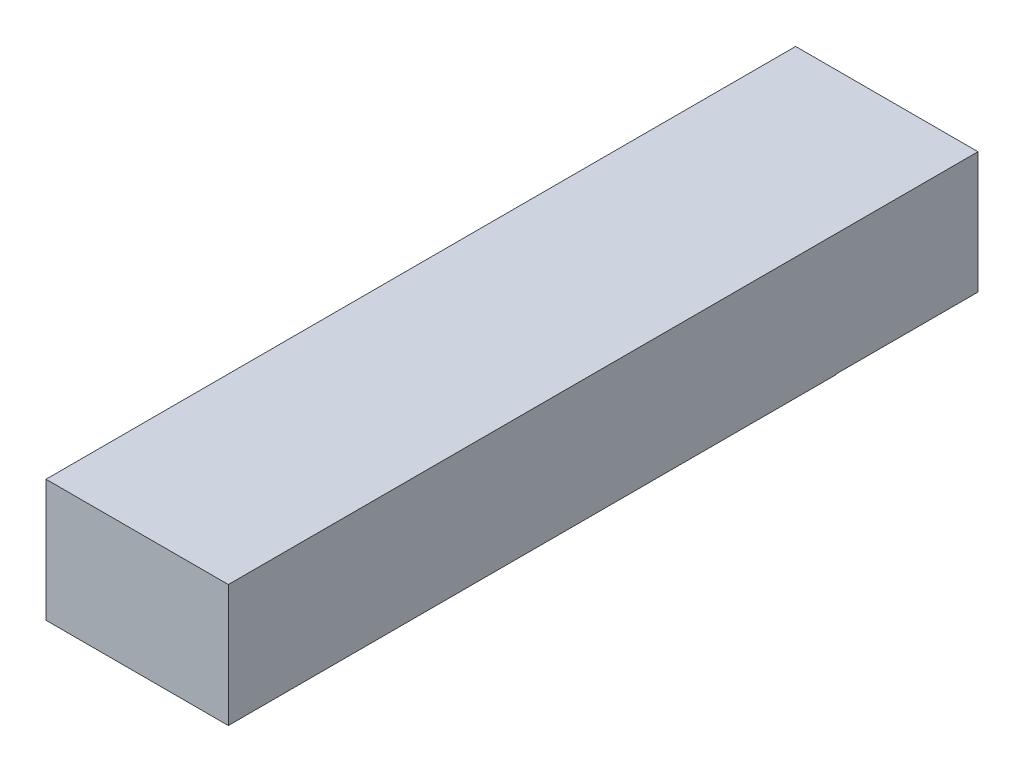
ISO-10303-21;
HEADER;
FILE_DESCRIPTION(('STEP AP214'),'2;1');
FILE_NAME('part.step','',(''),(''),'','','');
FILE_SCHEMA(('AUTOMOTIVE_DESIGN { 1 0 10303 214 1 1 1 1 }'));
ENDSEC;
DATA;
#1=APPLICATION_CONTEXT('core data for automotive mechanical design processes');
#2=APPLICATION_PROTOCOL_DEFINITION('international standard','automotive_design',2000,#1);
#3=PRODUCT_CONTEXT('',#1,'mechanical');
#4=PRODUCT('Part','Part','',(#3));
#5=PRODUCT_RELATED_PRODUCT_CATEGORY('part','',(#4));
#6=PRODUCT_DEFINITION_FORMATION('','',#4);
#7=PRODUCT_DEFINITION_CONTEXT('part definition',#1,'design');
#8=PRODUCT_DEFINITION('design','',#6,#7);
#9=PRODUCT_DEFINITION_SHAPE('','',#8);
#10=(LENGTH_UNIT() NAMED_UNIT(*) SI_UNIT(.MILLI.,.METRE.));
#11=(NAMED_UNIT(*) PLANE_ANGLE_UNIT() SI_UNIT($,.RADIAN.));
#12=(NAMED_UNIT(*) SI_UNIT($,.STERADIAN.) SOLID_ANGLE_UNIT());
#13=UNCERTAINTY_MEASURE_WITH_UNIT(LENGTH_MEASURE(1.E-05),#10,'distance_accuracy_value','');
#14=(GEOMETRIC_REPRESENTATION_CONTEXT(3) GLOBAL_UNCERTAINTY_ASSIGNED_CONTEXT((#13)) GLOBAL_UNIT_ASSIGNED_CONTEXT((#10,
#11,#12)) REPRESENTATION_CONTEXT('',''));
#15=CARTESIAN_POINT('',(0.,0.,0.));
#16=DIRECTION('',(0.,0.,1.));
#17=DIRECTION('',(1.,0.,0.));
#18=AXIS2_PLACEMENT_3D('',#15,#16,#17);
#19=CARTESIAN_POINT('',(2.8,-0.300000000000001,7.));
#20=DIRECTION('',(0.,-1.,0.));
#21=DIRECTION('',(0.,0.,-1.));
#22=AXIS2_PLACEMENT_3D('',#19,#20,#21);
#23=PLANE('',#22);
#24=DIRECTION('',(-1.,0.,0.));
#25=VECTOR('',#24,1.);
#26=CARTESIAN_POINT('',(2.8,-0.300000000000001,0.));
#27=LINE('',#26,#25);
#28=CARTESIAN_POINT('',(2.8,-0.300000000000001,0.));
#29=VERTEX_POINT('',#28);
#30=CARTESIAN_POINT('',(1.2,-0.300000000000001,0.));
#31=VERTEX_POINT('',#30);
#32=EDGE_CURVE('E172',#29,#31,#27,.T.);
#33=ORIENTED_EDGE('',*,*,#32,.T.);
#34=DIRECTION('',(0.,0.,-1.));
#35=VECTOR('',#34,1.);
#36=CARTESIAN_POINT('',(1.2,-0.300000000000001,7.));
#37=LINE('',#36,#35);
#38=CARTESIAN_POINT('',(1.2,-0.300000000000001,7.));
#39=VERTEX_POINT('',#38);
#40=EDGE_CURVE('E11',#39,#31,#37,.T.);
#41=ORIENTED_EDGE('',*,*,#40,.F.);
#42=DIRECTION('',(-1.,0.,0.));
#43=VECTOR('',#42,1.);
#44=CARTESIAN_POINT('',(2.8,-0.300000000000001,7.));
#45=LINE('',#44,#43);
#46=CARTESIAN_POINT('',(2.8,-0.300000000000001,7.));
#47=VERTEX_POINT('',#46);
#48=EDGE_CURVE('E207',#47,#39,#45,.T.);
#49=ORIENTED_EDGE('',*,*,#48,.F.);
#50=DIRECTION('',(0.,0.,-1.));
#51=VECTOR('',#50,1.);
#52=CARTESIAN_POINT('',(2.8,-0.300000000000001,7.));
#53=LINE('',#52,#51);
#54=EDGE_CURVE('E171',#47,#29,#53,.T.);
#55=ORIENTED_EDGE('',*,*,#54,.T.);
#56=EDGE_LOOP('',(#33,#41,#49,#55));
#57=FACE_BOUND('',#56,.T.);
#58=ADVANCED_FACE('F39',(#57),#23,.F.);
#59=CARTESIAN_POINT('',(1.2,-0.300000000000001,7.));
#60=DIRECTION('',(1.,0.,0.));
#61=DIRECTION('',(0.,1.,0.));
#62=AXIS2_PLACEMENT_3D('',#59,#60,#61);
#63=PLANE('',#62);
#64=DIRECTION('',(0.,-1.,0.));
#65=VECTOR('',#64,1.);
#66=CARTESIAN_POINT('',(1.2,-0.300000000000001,0.));
#67=LINE('',#66,#65);
#68=CARTESIAN_POINT('',(1.2,-2.,0.));
#69=VERTEX_POINT('',#68);
#70=EDGE_CURVE('E176',#31,#69,#67,.T.);
#71=ORIENTED_EDGE('',*,*,#70,.T.);
#72=DIRECTION('',(0.,0.,-1.));
#73=VECTOR('',#72,1.);
#74=CARTESIAN_POINT('',(1.2,-2.,7.));
#75=LINE('',#74,#73);
#76=CARTESIAN_POINT('',(1.2,-2.,7.));
#77=VERTEX_POINT('',#76);
#78=EDGE_CURVE('E48',#77,#69,#75,.T.);
#79=ORIENTED_EDGE('',*,*,#78,.F.);
#80=DIRECTION('',(0.,-1.,0.));
#81=VECTOR('',#80,1.);
#82=CARTESIAN_POINT('',(1.2,-0.300000000000001,7.));
#83=LINE('',#82,#81);
#84=EDGE_CURVE('E110',#39,#77,#83,.T.);
#85=ORIENTED_EDGE('',*,*,#84,.F.);
#86=ORIENTED_EDGE('',*,*,#40,.T.);
#87=EDGE_LOOP('',(#71,#79,#85,#86));
#88=FACE_BOUND('',#87,.T.);
#89=ADVANCED_FACE('F315',(#88),#63,.F.);
#90=CARTESIAN_POINT('',(1.2,-2.,7.));
#91=DIRECTION('',(0.,1.,0.));
#92=DIRECTION('',(-1.,0.,0.));
#93=AXIS2_PLACEMENT_3D('',#90,#91,#92);
#94=PLANE('',#93);
#95=DIRECTION('',(1.,0.,0.));
#96=VECTOR('',#95,1.);
#97=CARTESIAN_POINT('',(1.2,-2.,0.));
#98=LINE('',#97,#96);
#99=CARTESIAN_POINT('',(4.5,-2.,0.));
#100=VERTEX_POINT('',#99);
#101=EDGE_CURVE('E180',#69,#100,#98,.T.);
#102=ORIENTED_EDGE('',*,*,#101,.T.);
#103=DIRECTION('',(0.,0.,-1.));
#104=VECTOR('',#103,1.);
#105=CARTESIAN_POINT('',(4.5,-2.,7.));
#106=LINE('',#105,#104);
#107=CARTESIAN_POINT('',(4.5,-2.,7.));
#108=VERTEX_POINT('',#107);
#109=EDGE_CURVE('E232',#108,#100,#106,.T.);
#110=ORIENTED_EDGE('',*,*,#109,.F.);
#111=DIRECTION('',(1.,0.,0.));
#112=VECTOR('',#111,1.);
#113=CARTESIAN_POINT('',(1.2,-2.,7.));
#114=LINE('',#113,#112);
#115=EDGE_CURVE('E242',#77,#108,#114,.T.);
#116=ORIENTED_EDGE('',*,*,#115,.F.);
#117=ORIENTED_EDGE('',*,*,#78,.T.);
#118=EDGE_LOOP('',(#102,#110,#116,#117));
#119=FACE_BOUND('',#118,.T.);
#120=ADVANCED_FACE('F240',(#119),#94,.F.);
#121=CARTESIAN_POINT('',(4.5,-2.,7.));
#122=DIRECTION('',(-1.,0.,0.));
#123=DIRECTION('',(0.,0.,1.));
#124=AXIS2_PLACEMENT_3D('',#121,#122,#123);
#125=PLANE('',#124);
#126=DIRECTION('',(0.,1.,0.));
#127=VECTOR('',#126,1.);
#128=CARTESIAN_POINT('',(4.5,-2.,0.));
#129=LINE('',#128,#127);
#130=CARTESIAN_POINT('',(4.5,4.,0.));
#131=VERTEX_POINT('',#130);
#132=EDGE_CURVE('E183',#100,#131,#129,.T.);
#133=ORIENTED_EDGE('',*,*,#132,.T.);
#134=DIRECTION('',(0.,0.,-1.));
#135=VECTOR('',#134,1.);
#136=CARTESIAN_POINT('',(4.5,4.,7.));
#137=LINE('',#136,#135);
#138=CARTESIAN_POINT('',(4.5,4.,37.));
#139=VERTEX_POINT('',#138);
#140=EDGE_CURVE('E228',#139,#131,#137,.T.);
#141=ORIENTED_EDGE('',*,*,#140,.F.);
#142=DIRECTION('',(0.,1.,0.));
#143=VECTOR('',#142,1.);
#144=CARTESIAN_POINT('',(4.5,4.,37.));
#145=LINE('',#144,#143);
#146=CARTESIAN_POINT('',(4.5,-2.02868254739902,37.));
#147=VERTEX_POINT('',#146);
#148=EDGE_CURVE('E270',#147,#139,#145,.T.);
#149=ORIENTED_EDGE('',*,*,#148,.F.);
#150=DIRECTION('',(0.,0.,-1.));
#151=VECTOR('',#150,1.);
#152=CARTESIAN_POINT('',(4.5,-2.02868254739902,37.));
#153=LINE('',#152,#151);
#154=CARTESIAN_POINT('',(4.5,-2.02868254739902,7.));
#155=VERTEX_POINT('',#154);
#156=EDGE_CURVE('E269',#147,#155,#153,.T.);
#157=ORIENTED_EDGE('',*,*,#156,.T.);
#158=DIRECTION('',(0.,1.,0.));
#159=VECTOR('',#158,1.);
#160=CARTESIAN_POINT('',(4.5,4.,7.));
#161=LINE('',#160,#159);
#162=EDGE_CURVE('E288',#155,#108,#161,.T.);
#163=ORIENTED_EDGE('',*,*,#162,.T.);
#164=ORIENTED_EDGE('',*,*,#109,.T.);
#165=EDGE_LOOP('',(#133,#141,#149,#157,#163,#164));
#166=FACE_BOUND('',#165,.T.);
#167=ADVANCED_FACE('F251',(#166),#125,.F.);
#168=CARTESIAN_POINT('',(-4.5,4.,7.));
#169=DIRECTION('',(0.,-1.,0.));
#170=DIRECTION('',(0.,0.,-1.));
#171=AXIS2_PLACEMENT_3D('',#168,#169,#170);
#172=PLANE('',#171);
#173=DIRECTION('',(-1.,0.,0.));
#174=VECTOR('',#173,1.);
#175=CARTESIAN_POINT('',(-4.5,4.,0.));
#176=LINE('',#175,#174);
#177=CARTESIAN_POINT('',(-4.5,4.,0.));
#178=VERTEX_POINT('',#177);
#179=EDGE_CURVE('E186',#131,#178,#176,.T.);
#180=ORIENTED_EDGE('',*,*,#179,.T.);
#181=DIRECTION('',(0.,0.,-1.));
#182=VECTOR('',#181,1.);
#183=CARTESIAN_POINT('',(-4.5,4.,7.));
#184=LINE('',#183,#182);
#185=CARTESIAN_POINT('',(-4.5,4.,37.));
#186=VERTEX_POINT('',#185);
#187=EDGE_CURVE('E224',#186,#178,#184,.T.);
#188=ORIENTED_EDGE('',*,*,#187,.F.);
#189=DIRECTION('',(-1.,0.,0.));
#190=VECTOR('',#189,1.);
#191=CARTESIAN_POINT('',(-4.5,4.,37.));
#192=LINE('',#191,#190);
#193=EDGE_CURVE('E261',#139,#186,#192,.T.);
#194=ORIENTED_EDGE('',*,*,#193,.F.);
#195=ORIENTED_EDGE('',*,*,#140,.T.);
#196=EDGE_LOOP('',(#180,#188,#194,#195));
#197=FACE_BOUND('',#196,.T.);
#198=ADVANCED_FACE('F258',(#197),#172,.F.);
#199=CARTESIAN_POINT('',(-4.5,-2.,7.));
#200=DIRECTION('',(1.,0.,0.));
#201=DIRECTION('',(0.,0.,-1.));
#202=AXIS2_PLACEMENT_3D('',#199,#200,#201);
#203=PLANE('',#202);
#204=DIRECTION('',(0.,-1.,0.));
#205=VECTOR('',#204,1.);
#206=CARTESIAN_POINT('',(-4.5,-2.,0.));
#207=LINE('',#206,#205);
#208=CARTESIAN_POINT('',(-4.5,-2.,0.));
#209=VERTEX_POINT('',#208);
#210=EDGE_CURVE('E189',#178,#209,#207,.T.);
#211=ORIENTED_EDGE('',*,*,#210,.T.);
#212=DIRECTION('',(0.,0.,-1.));
#213=VECTOR('',#212,1.);
#214=CARTESIAN_POINT('',(-4.5,-2.,7.));
#215=LINE('',#214,#213);
#216=CARTESIAN_POINT('',(-4.5,-2.,7.));
#217=VERTEX_POINT('',#216);
#218=EDGE_CURVE('E220',#217,#209,#215,.T.);
#219=ORIENTED_EDGE('',*,*,#218,.F.);
#220=DIRECTION('',(0.,-1.,0.));
#221=VECTOR('',#220,1.);
#222=CARTESIAN_POINT('',(-4.5,4.,7.));
#223=LINE('',#222,#221);
#224=CARTESIAN_POINT('',(-4.5,-2.02868254739902,7.));
#225=VERTEX_POINT('',#224);
#226=EDGE_CURVE('E280',#217,#225,#223,.T.);
#227=ORIENTED_EDGE('',*,*,#226,.T.);
#228=DIRECTION('',(0.,0.,-1.));
#229=VECTOR('',#228,1.);
#230=CARTESIAN_POINT('',(-4.5,-2.02868254739902,37.));
#231=LINE('',#230,#229);
#232=CARTESIAN_POINT('',(-4.5,-2.02868254739902,37.));
#233=VERTEX_POINT('',#232);
#234=EDGE_CURVE('E177',#233,#225,#231,.T.);
#235=ORIENTED_EDGE('',*,*,#234,.F.);
#236=DIRECTION('',(0.,-1.,0.));
#237=VECTOR('',#236,1.);
#238=CARTESIAN_POINT('',(-4.5,4.,37.));
#239=LINE('',#238,#237);
#240=EDGE_CURVE('E290',#186,#233,#239,.T.);
#241=ORIENTED_EDGE('',*,*,#240,.F.);
#242=ORIENTED_EDGE('',*,*,#187,.T.);
#243=EDGE_LOOP('',(#211,#219,#227,#235,#241,#242));
#244=FACE_BOUND('',#243,.T.);
#245=ADVANCED_FACE('F327',(#244),#203,.F.);
#246=CARTESIAN_POINT('',(-1.2,-2.,7.));
#247=DIRECTION('',(0.,1.,0.));
#248=DIRECTION('',(-1.,0.,0.));
#249=AXIS2_PLACEMENT_3D('',#246,#247,#248);
#250=PLANE('',#249);
#251=DIRECTION('',(1.,0.,0.));
#252=VECTOR('',#251,1.);
#253=CARTESIAN_POINT('',(-1.2,-2.,0.));
#254=LINE('',#253,#252);
#255=CARTESIAN_POINT('',(-1.2,-2.,0.));
#256=VERTEX_POINT('',#255);
#257=EDGE_CURVE('E192',#209,#256,#254,.T.);
#258=ORIENTED_EDGE('',*,*,#257,.T.);
#259=DIRECTION('',(0.,0.,-1.));
#260=VECTOR('',#259,1.);
#261=CARTESIAN_POINT('',(-1.2,-2.,7.));
#262=LINE('',#261,#260);
#263=CARTESIAN_POINT('',(-1.2,-2.,7.));
#264=VERTEX_POINT('',#263);
#265=EDGE_CURVE('E216',#264,#256,#262,.T.);
#266=ORIENTED_EDGE('',*,*,#265,.F.);
#267=DIRECTION('',(1.,0.,0.));
#268=VECTOR('',#267,1.);
#269=CARTESIAN_POINT('',(-1.2,-2.,7.));
#270=LINE('',#269,#268);
#271=EDGE_CURVE('E161',#217,#264,#270,.T.);
#272=ORIENTED_EDGE('',*,*,#271,.F.);
#273=ORIENTED_EDGE('',*,*,#218,.T.);
#274=EDGE_LOOP('',(#258,#266,#272,#273));
#275=FACE_BOUND('',#274,.T.);
#276=ADVANCED_FACE('F306',(#275),#250,.F.);
#277=CARTESIAN_POINT('',(-1.2,-0.300000000000001,7.));
#278=DIRECTION('',(-1.,0.,0.));
#279=DIRECTION('',(0.,-1.,0.));
#280=AXIS2_PLACEMENT_3D('',#277,#278,#279);
#281=PLANE('',#280);
#282=DIRECTION('',(0.,1.,0.));
#283=VECTOR('',#282,1.);
#284=CARTESIAN_POINT('',(-1.2,-0.300000000000001,0.));
#285=LINE('',#284,#283);
#286=CARTESIAN_POINT('',(-1.2,-0.300000000000001,0.));
#287=VERTEX_POINT('',#286);
#288=EDGE_CURVE('E195',#256,#287,#285,.T.);
#289=ORIENTED_EDGE('',*,*,#288,.T.);
#290=DIRECTION('',(0.,0.,-1.));
#291=VECTOR('',#290,1.);
#292=CARTESIAN_POINT('',(-1.2,-0.300000000000001,7.));
#293=LINE('',#292,#291);
#294=CARTESIAN_POINT('',(-1.2,-0.300000000000001,7.));
#295=VERTEX_POINT('',#294);
#296=EDGE_CURVE('E143',#295,#287,#293,.T.);
#297=ORIENTED_EDGE('',*,*,#296,.F.);
#298=DIRECTION('',(0.,1.,0.));
#299=VECTOR('',#298,1.);
#300=CARTESIAN_POINT('',(-1.2,-0.300000000000001,7.));
#301=LINE('',#300,#299);
#302=EDGE_CURVE('E157',#264,#295,#301,.T.);
#303=ORIENTED_EDGE('',*,*,#302,.F.);
#304=ORIENTED_EDGE('',*,*,#265,.T.);
#305=EDGE_LOOP('',(#289,#297,#303,#304));
#306=FACE_BOUND('',#305,.T.);
#307=ADVANCED_FACE('F310',(#306),#281,.F.);
#308=CARTESIAN_POINT('',(-2.8,-0.300000000000001,7.));
#309=DIRECTION('',(0.,-1.,0.));
#310=DIRECTION('',(0.,0.,-1.));
#311=AXIS2_PLACEMENT_3D('',#308,#309,#310);
#312=PLANE('',#311);
#313=DIRECTION('',(-1.,0.,0.));
#314=VECTOR('',#313,1.);
#315=CARTESIAN_POINT('',(-2.8,-0.300000000000001,0.));
#316=LINE('',#315,#314);
#317=CARTESIAN_POINT('',(-2.8,-0.300000000000001,0.));
#318=VERTEX_POINT('',#317);
#319=EDGE_CURVE('E139',#287,#318,#316,.T.);
#320=ORIENTED_EDGE('',*,*,#319,.T.);
#321=DIRECTION('',(0.,0.,-1.));
#322=VECTOR('',#321,1.);
#323=CARTESIAN_POINT('',(-2.8,-0.300000000000001,7.));
#324=LINE('',#323,#322);
#325=CARTESIAN_POINT('',(-2.8,-0.300000000000001,7.));
#326=VERTEX_POINT('',#325);
#327=EDGE_CURVE('E131',#326,#318,#324,.T.);
#328=ORIENTED_EDGE('',*,*,#327,.F.);
#329=DIRECTION('',(-1.,0.,0.));
#330=VECTOR('',#329,1.);
#331=CARTESIAN_POINT('',(-2.8,-0.300000000000001,7.));
#332=LINE('',#331,#330);
#333=EDGE_CURVE('E136',#295,#326,#332,.T.);
#334=ORIENTED_EDGE('',*,*,#333,.F.);
#335=ORIENTED_EDGE('',*,*,#296,.T.);
#336=EDGE_LOOP('',(#320,#328,#334,#335));
#337=FACE_BOUND('',#336,.T.);
#338=ADVANCED_FACE('F133',(#337),#312,.F.);
#339=CARTESIAN_POINT('',(-2.8,2.,7.));
#340=DIRECTION('',(-1.,0.,0.));
#341=DIRECTION('',(0.,-1.,0.));
#342=AXIS2_PLACEMENT_3D('',#339,#340,#341);
#343=PLANE('',#342);
#344=DIRECTION('',(0.,1.,0.));
#345=VECTOR('',#344,1.);
#346=CARTESIAN_POINT('',(-2.8,2.,0.));
#347=LINE('',#346,#345);
#348=CARTESIAN_POINT('',(-2.8,2.,0.));
#349=VERTEX_POINT('',#348);
#350=EDGE_CURVE('E200',#318,#349,#347,.T.);
#351=ORIENTED_EDGE('',*,*,#350,.T.);
#352=DIRECTION('',(0.,0.,-1.));
#353=VECTOR('',#352,1.);
#354=CARTESIAN_POINT('',(-2.8,2.,7.));
#355=LINE('',#354,#353);
#356=CARTESIAN_POINT('',(-2.8,2.,7.));
#357=VERTEX_POINT('',#356);
#358=EDGE_CURVE('E144',#357,#349,#355,.T.);
#359=ORIENTED_EDGE('',*,*,#358,.F.);
#360=DIRECTION('',(0.,1.,0.));
#361=VECTOR('',#360,1.);
#362=CARTESIAN_POINT('',(-2.8,2.,7.));
#363=LINE('',#362,#361);
#364=EDGE_CURVE('E147',#326,#357,#363,.T.);
#365=ORIENTED_EDGE('',*,*,#364,.F.);
#366=ORIENTED_EDGE('',*,*,#327,.T.);
#367=EDGE_LOOP('',(#351,#359,#365,#366));
#368=FACE_BOUND('',#367,.T.);
#369=ADVANCED_FACE('F148',(#368),#343,.F.);
#370=CARTESIAN_POINT('',(2.8,2.,7.));
#371=DIRECTION('',(0.,1.,0.));
#372=DIRECTION('',(0.,0.,1.));
#373=AXIS2_PLACEMENT_3D('',#370,#371,#372);
#374=PLANE('',#373);
#375=DIRECTION('',(1.,0.,0.));
#376=VECTOR('',#375,1.);
#377=CARTESIAN_POINT('',(2.8,2.,0.));
#378=LINE('',#377,#376);
#379=CARTESIAN_POINT('',(2.8,2.,0.));
#380=VERTEX_POINT('',#379);
#381=EDGE_CURVE('E96',#349,#380,#378,.T.);
#382=ORIENTED_EDGE('',*,*,#381,.T.);
#383=DIRECTION('',(0.,0.,-1.));
#384=VECTOR('',#383,1.);
#385=CARTESIAN_POINT('',(2.8,2.,7.));
#386=LINE('',#385,#384);
#387=CARTESIAN_POINT('',(2.8,2.,7.));
#388=VERTEX_POINT('',#387);
#389=EDGE_CURVE('E56',#388,#380,#386,.T.);
#390=ORIENTED_EDGE('',*,*,#389,.F.);
#391=DIRECTION('',(1.,0.,0.));
#392=VECTOR('',#391,1.);
#393=CARTESIAN_POINT('',(2.8,2.,7.));
#394=LINE('',#393,#392);
#395=EDGE_CURVE('E152',#357,#388,#394,.T.);
#396=ORIENTED_EDGE('',*,*,#395,.F.);
#397=ORIENTED_EDGE('',*,*,#358,.T.);
#398=EDGE_LOOP('',(#382,#390,#396,#397));
#399=FACE_BOUND('',#398,.T.);
#400=ADVANCED_FACE('F311',(#399),#374,.F.);
#401=CARTESIAN_POINT('',(2.8,2.,7.));
#402=DIRECTION('',(1.,0.,0.));
#403=DIRECTION('',(0.,1.,0.));
#404=AXIS2_PLACEMENT_3D('',#401,#402,#403);
#405=PLANE('',#404);
#406=DIRECTION('',(0.,-1.,0.));
#407=VECTOR('',#406,1.);
#408=CARTESIAN_POINT('',(2.8,2.,0.));
#409=LINE('',#408,#407);
#410=EDGE_CURVE('E102',#380,#29,#409,.T.);
#411=ORIENTED_EDGE('',*,*,#410,.T.);
#412=ORIENTED_EDGE('',*,*,#54,.F.);
#413=DIRECTION('',(0.,-1.,0.));
#414=VECTOR('',#413,1.);
#415=CARTESIAN_POINT('',(2.8,2.,7.));
#416=LINE('',#415,#414);
#417=EDGE_CURVE('E167',#388,#47,#416,.T.);
#418=ORIENTED_EDGE('',*,*,#417,.F.);
#419=ORIENTED_EDGE('',*,*,#389,.T.);
#420=EDGE_LOOP('',(#411,#412,#418,#419));
#421=FACE_BOUND('',#420,.T.);
#422=ADVANCED_FACE('F313',(#421),#405,.F.);
#423=CARTESIAN_POINT('',(0.,0.,0.));
#424=DIRECTION('',(0.,0.,1.));
#425=DIRECTION('',(1.,0.,0.));
#426=AXIS2_PLACEMENT_3D('',#423,#424,#425);
#427=PLANE('',#426);
#428=ORIENTED_EDGE('',*,*,#32,.F.);
#429=ORIENTED_EDGE('',*,*,#410,.F.);
#430=ORIENTED_EDGE('',*,*,#381,.F.);
#431=ORIENTED_EDGE('',*,*,#350,.F.);
#432=ORIENTED_EDGE('',*,*,#319,.F.);
#433=ORIENTED_EDGE('',*,*,#288,.F.);
#434=ORIENTED_EDGE('',*,*,#257,.F.);
#435=ORIENTED_EDGE('',*,*,#210,.F.);
#436=ORIENTED_EDGE('',*,*,#179,.F.);
#437=ORIENTED_EDGE('',*,*,#132,.F.);
#438=ORIENTED_EDGE('',*,*,#101,.F.);
#439=ORIENTED_EDGE('',*,*,#70,.F.);
#440=EDGE_LOOP('',(#428,#429,#430,#431,#432,#433,#434,#435,#436,#437,#438,#439));
#441=FACE_BOUND('',#440,.T.);
#442=ADVANCED_FACE('F246',(#441),#427,.F.);
#443=CARTESIAN_POINT('',(0.,0.,7.));
#444=DIRECTION('',(0.,0.,1.));
#445=DIRECTION('',(1.,0.,0.));
#446=AXIS2_PLACEMENT_3D('',#443,#444,#445);
#447=PLANE('',#446);
#448=ORIENTED_EDGE('',*,*,#84,.T.);
#449=ORIENTED_EDGE('',*,*,#115,.T.);
#450=ORIENTED_EDGE('',*,*,#162,.F.);
#451=DIRECTION('',(1.,0.,0.));
#452=VECTOR('',#451,1.);
#453=CARTESIAN_POINT('',(-4.5,-2.02868254739902,7.));
#454=LINE('',#453,#452);
#455=EDGE_CURVE('E284',#225,#155,#454,.T.);
#456=ORIENTED_EDGE('',*,*,#455,.F.);
#457=ORIENTED_EDGE('',*,*,#226,.F.);
#458=ORIENTED_EDGE('',*,*,#271,.T.);
#459=ORIENTED_EDGE('',*,*,#302,.T.);
#460=ORIENTED_EDGE('',*,*,#333,.T.);
#461=ORIENTED_EDGE('',*,*,#364,.T.);
#462=ORIENTED_EDGE('',*,*,#395,.T.);
#463=ORIENTED_EDGE('',*,*,#417,.T.);
#464=ORIENTED_EDGE('',*,*,#48,.T.);
#465=EDGE_LOOP('',(#448,#449,#450,#456,#457,#458,#459,#460,#461,#462,#463,#464));
#466=FACE_BOUND('',#465,.T.);
#467=ADVANCED_FACE('F154',(#466),#447,.F.);
#468=CARTESIAN_POINT('',(-4.5,-2.02868254739902,37.));
#469=DIRECTION('',(0.,1.,0.));
#470=DIRECTION('',(0.,0.,1.));
#471=AXIS2_PLACEMENT_3D('',#468,#469,#470);
#472=PLANE('',#471);
#473=ORIENTED_EDGE('',*,*,#455,.T.);
#474=ORIENTED_EDGE('',*,*,#156,.F.);
#475=DIRECTION('',(1.,0.,0.));
#476=VECTOR('',#475,1.);
#477=CARTESIAN_POINT('',(-4.5,-2.02868254739902,37.));
#478=LINE('',#477,#476);
#479=EDGE_CURVE('E276',#233,#147,#478,.T.);
#480=ORIENTED_EDGE('',*,*,#479,.F.);
#481=ORIENTED_EDGE('',*,*,#234,.T.);
#482=EDGE_LOOP('',(#473,#474,#480,#481));
#483=FACE_BOUND('',#482,.T.);
#484=ADVANCED_FACE('F345',(#483),#472,.F.);
#485=CARTESIAN_POINT('',(0.,0.,37.));
#486=DIRECTION('',(0.,0.,1.));
#487=DIRECTION('',(1.,0.,0.));
#488=AXIS2_PLACEMENT_3D('',#485,#486,#487);
#489=PLANE('',#488);
#490=ORIENTED_EDGE('',*,*,#240,.T.);
#491=ORIENTED_EDGE('',*,*,#479,.T.);
#492=ORIENTED_EDGE('',*,*,#148,.T.);
#493=ORIENTED_EDGE('',*,*,#193,.T.);
#494=EDGE_LOOP('',(#490,#491,#492,#493));
#495=FACE_BOUND('',#494,.T.);
#496=ADVANCED_FACE('F348',(#495),#489,.T.);
#497=CLOSED_SHELL('',(#58,#89,#120,#167,#198,#245,#276,#307,#338,#369,#400,#422,#442,#467,#484,#496));
#498=MANIFOLD_SOLID_BREP('B2',#497);
#499=ADVANCED_BREP_SHAPE_REPRESENTATION('',(#18,#498),#14);
#500=SHAPE_DEFINITION_REPRESENTATION(#9,#499);
ENDSEC;
END-ISO-10303-21;
